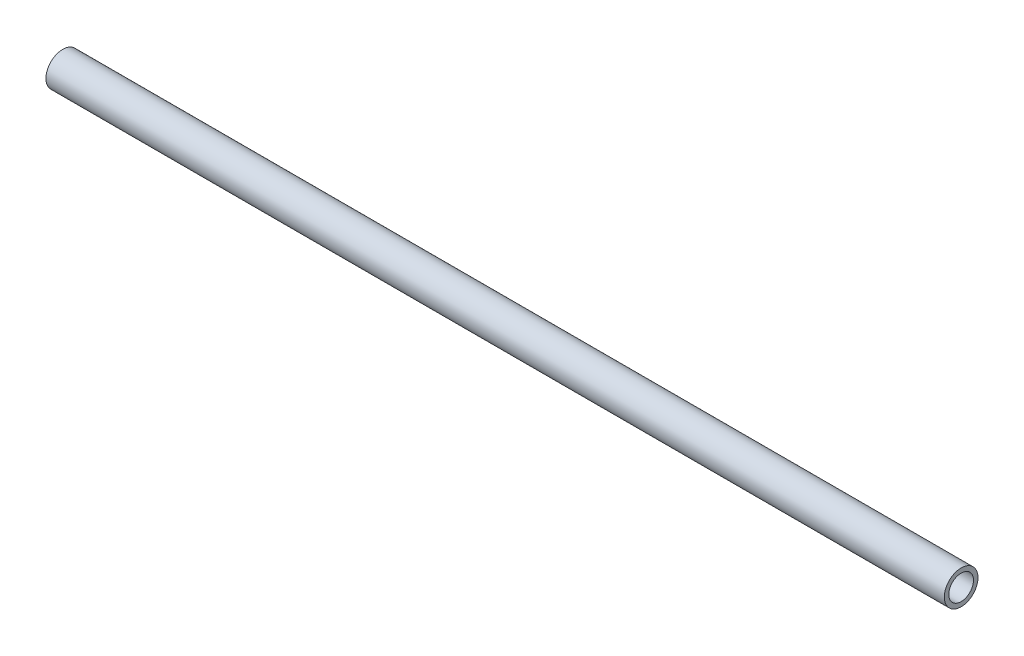
ISO-10303-21;
HEADER;
FILE_DESCRIPTION(('STEP AP214'),'2;1');
FILE_NAME('part.step','',(''),(''),'','','');
FILE_SCHEMA(('AUTOMOTIVE_DESIGN { 1 0 10303 214 1 1 1 1 }'));
ENDSEC;
DATA;
#1=APPLICATION_CONTEXT('core data for automotive mechanical design processes');
#2=APPLICATION_PROTOCOL_DEFINITION('international standard','automotive_design',2000,#1);
#3=PRODUCT_CONTEXT('',#1,'mechanical');
#4=PRODUCT('Part','Part','',(#3));
#5=PRODUCT_RELATED_PRODUCT_CATEGORY('part','',(#4));
#6=PRODUCT_DEFINITION_FORMATION('','',#4);
#7=PRODUCT_DEFINITION_CONTEXT('part definition',#1,'design');
#8=PRODUCT_DEFINITION('design','',#6,#7);
#9=PRODUCT_DEFINITION_SHAPE('','',#8);
#10=(LENGTH_UNIT() NAMED_UNIT(*) SI_UNIT(.MILLI.,.METRE.));
#11=(NAMED_UNIT(*) PLANE_ANGLE_UNIT() SI_UNIT($,.RADIAN.));
#12=(NAMED_UNIT(*) SI_UNIT($,.STERADIAN.) SOLID_ANGLE_UNIT());
#13=UNCERTAINTY_MEASURE_WITH_UNIT(LENGTH_MEASURE(1.E-05),#10,'distance_accuracy_value','');
#14=(GEOMETRIC_REPRESENTATION_CONTEXT(3) GLOBAL_UNCERTAINTY_ASSIGNED_CONTEXT((#13)) GLOBAL_UNIT_ASSIGNED_CONTEXT((#10,
#11,#12)) REPRESENTATION_CONTEXT('',''));
#15=CARTESIAN_POINT('',(0.,0.,0.));
#16=DIRECTION('',(0.,0.,1.));
#17=DIRECTION('',(1.,0.,0.));
#18=AXIS2_PLACEMENT_3D('',#15,#16,#17);
#19=CARTESIAN_POINT('',(-390.178402047366,-1.01100054882774,0.));
#20=DIRECTION('',(1.,0.,0.));
#21=DIRECTION('',(0.,1.,0.));
#22=AXIS2_PLACEMENT_3D('',#19,#20,#21);
#23=CYLINDRICAL_SURFACE('',#22,7.5);
#24=CARTESIAN_POINT('',(9.8215979526341,-1.01100054882773,0.));
#25=DIRECTION('',(1.,0.,0.));
#26=DIRECTION('',(0.,0.,-1.));
#27=AXIS2_PLACEMENT_3D('',#24,#25,#26);
#28=CIRCLE('',#27,7.5);
#29=CARTESIAN_POINT('',(9.8215979526341,-1.01100054882773,-7.5));
#30=VERTEX_POINT('',#29);
#31=EDGE_CURVE('E44',#30,#30,#28,.T.);
#32=ORIENTED_EDGE('',*,*,#31,.F.);
#33=EDGE_LOOP('',(#32));
#34=FACE_BOUND('',#33,.T.);
#35=CARTESIAN_POINT('',(-390.178402047366,-1.01100054882774,0.));
#36=DIRECTION('',(1.,0.,0.));
#37=DIRECTION('',(0.,0.,-1.));
#38=AXIS2_PLACEMENT_3D('',#35,#36,#37);
#39=CIRCLE('',#38,7.5);
#40=CARTESIAN_POINT('',(-390.178402047366,-1.01100054882774,-7.5));
#41=VERTEX_POINT('',#40);
#42=EDGE_CURVE('E35',#41,#41,#39,.T.);
#43=ORIENTED_EDGE('',*,*,#42,.T.);
#44=EDGE_LOOP('',(#43));
#45=FACE_BOUND('',#44,.T.);
#46=ADVANCED_FACE('F32',(#34,#45),#23,.T.);
#47=CARTESIAN_POINT('',(-390.178402047366,-1.01100054882774,0.));
#48=DIRECTION('',(1.,0.,0.));
#49=DIRECTION('',(0.,0.,-1.));
#50=AXIS2_PLACEMENT_3D('',#47,#48,#49);
#51=PLANE('',#50);
#52=CARTESIAN_POINT('',(-390.178402047366,-1.01100054882774,0.));
#53=DIRECTION('',(1.,0.,0.));
#54=DIRECTION('',(0.,0.,-1.));
#55=AXIS2_PLACEMENT_3D('',#52,#53,#54);
#56=CIRCLE('',#55,5.5);
#57=CARTESIAN_POINT('',(-390.178402047366,-1.01100054882774,-5.5));
#58=VERTEX_POINT('',#57);
#59=EDGE_CURVE('E39',#58,#58,#56,.F.);
#60=ORIENTED_EDGE('',*,*,#59,.F.);
#61=EDGE_LOOP('',(#60));
#62=FACE_BOUND('',#61,.T.);
#63=ORIENTED_EDGE('',*,*,#42,.F.);
#64=EDGE_LOOP('',(#63));
#65=FACE_BOUND('',#64,.T.);
#66=ADVANCED_FACE('F53',(#62,#65),#51,.F.);
#67=CARTESIAN_POINT('',(9.8215979526341,-1.01100054882773,0.));
#68=DIRECTION('',(1.,0.,0.));
#69=DIRECTION('',(0.,0.,-1.));
#70=AXIS2_PLACEMENT_3D('',#67,#68,#69);
#71=PLANE('',#70);
#72=CARTESIAN_POINT('',(9.8215979526341,-1.01100054882773,0.));
#73=DIRECTION('',(1.,0.,0.));
#74=DIRECTION('',(0.,0.,-1.));
#75=AXIS2_PLACEMENT_3D('',#72,#73,#74);
#76=CIRCLE('',#75,5.5);
#77=CARTESIAN_POINT('',(9.8215979526341,-1.01100054882773,-5.5));
#78=VERTEX_POINT('',#77);
#79=EDGE_CURVE('E10',#78,#78,#76,.F.);
#80=ORIENTED_EDGE('',*,*,#79,.T.);
#81=EDGE_LOOP('',(#80));
#82=FACE_BOUND('',#81,.T.);
#83=ORIENTED_EDGE('',*,*,#31,.T.);
#84=EDGE_LOOP('',(#83));
#85=FACE_BOUND('',#84,.T.);
#86=ADVANCED_FACE('F55',(#82,#85),#71,.T.);
#87=CARTESIAN_POINT('',(-390.178402047366,-1.01100054882774,0.));
#88=DIRECTION('',(1.,0.,0.));
#89=DIRECTION('',(0.,1.,0.));
#90=AXIS2_PLACEMENT_3D('',#87,#88,#89);
#91=CYLINDRICAL_SURFACE('',#90,5.5);
#92=ORIENTED_EDGE('',*,*,#79,.F.);
#93=EDGE_LOOP('',(#92));
#94=FACE_BOUND('',#93,.T.);
#95=ORIENTED_EDGE('',*,*,#59,.T.);
#96=EDGE_LOOP('',(#95));
#97=FACE_BOUND('',#96,.T.);
#98=ADVANCED_FACE('F61',(#94,#97),#91,.F.);
#99=CLOSED_SHELL('',(#46,#66,#86,#98));
#100=MANIFOLD_SOLID_BREP('B2',#99);
#101=ADVANCED_BREP_SHAPE_REPRESENTATION('',(#18,#100),#14);
#102=SHAPE_DEFINITION_REPRESENTATION(#9,#101);
ENDSEC;
END-ISO-10303-21;
